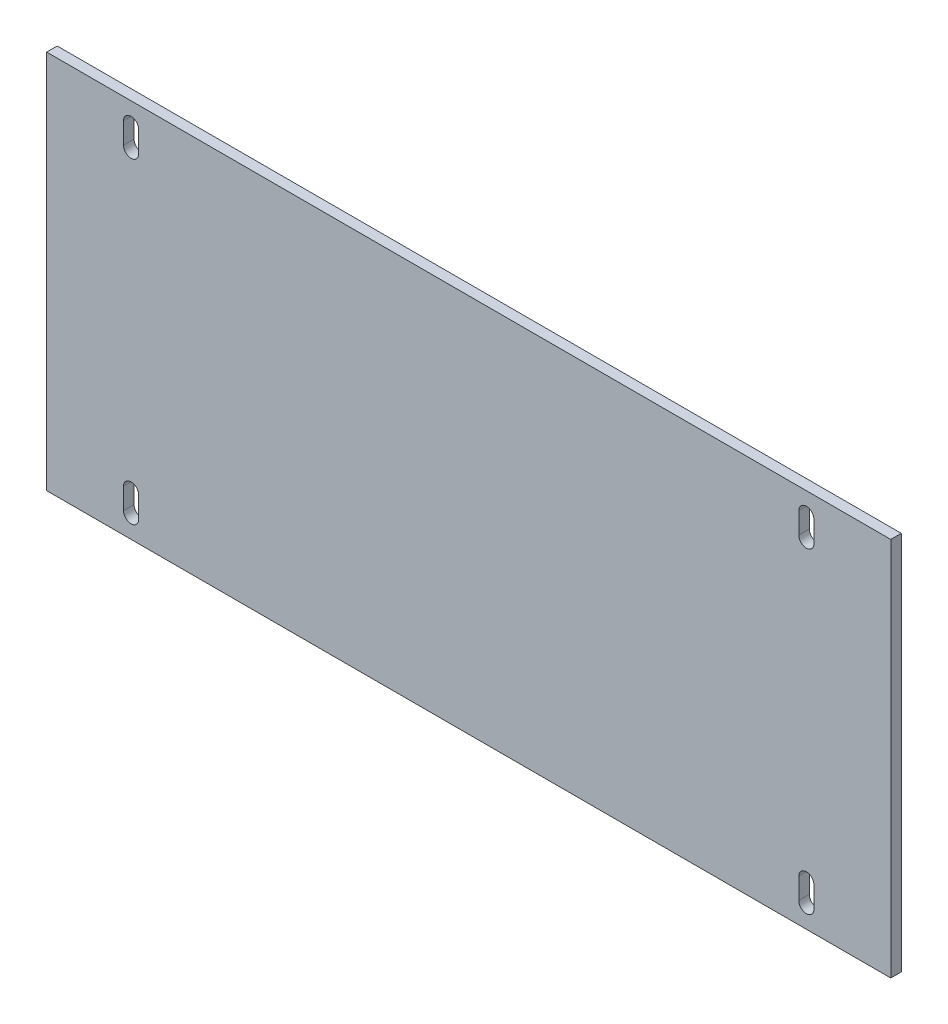
ISO-10303-21;
HEADER;
FILE_DESCRIPTION(('STEP AP214'),'2;1');
FILE_NAME('part.step','',(''),(''),'','','');
FILE_SCHEMA(('AUTOMOTIVE_DESIGN { 1 0 10303 214 1 1 1 1 }'));
ENDSEC;
DATA;
#1=APPLICATION_CONTEXT('core data for automotive mechanical design processes');
#2=APPLICATION_PROTOCOL_DEFINITION('international standard','automotive_design',2000,#1);
#3=PRODUCT_CONTEXT('',#1,'mechanical');
#4=PRODUCT('Part','Part','',(#3));
#5=PRODUCT_RELATED_PRODUCT_CATEGORY('part','',(#4));
#6=PRODUCT_DEFINITION_FORMATION('','',#4);
#7=PRODUCT_DEFINITION_CONTEXT('part definition',#1,'design');
#8=PRODUCT_DEFINITION('design','',#6,#7);
#9=PRODUCT_DEFINITION_SHAPE('','',#8);
#10=(LENGTH_UNIT() NAMED_UNIT(*) SI_UNIT(.MILLI.,.METRE.));
#11=(NAMED_UNIT(*) PLANE_ANGLE_UNIT() SI_UNIT($,.RADIAN.));
#12=(NAMED_UNIT(*) SI_UNIT($,.STERADIAN.) SOLID_ANGLE_UNIT());
#13=UNCERTAINTY_MEASURE_WITH_UNIT(LENGTH_MEASURE(1.E-05),#10,'distance_accuracy_value','');
#14=(GEOMETRIC_REPRESENTATION_CONTEXT(3) GLOBAL_UNCERTAINTY_ASSIGNED_CONTEXT((#13)) GLOBAL_UNIT_ASSIGNED_CONTEXT((#10,
#11,#12)) REPRESENTATION_CONTEXT('',''));
#15=CARTESIAN_POINT('',(0.,0.,0.));
#16=DIRECTION('',(0.,0.,1.));
#17=DIRECTION('',(1.,0.,0.));
#18=AXIS2_PLACEMENT_3D('',#15,#16,#17);
#19=CARTESIAN_POINT('',(0.,0.,5.));
#20=DIRECTION('',(0.,0.,-1.));
#21=DIRECTION('',(-1.,0.,0.));
#22=AXIS2_PLACEMENT_3D('',#19,#20,#21);
#23=PLANE('',#22);
#24=DIRECTION('',(0.,1.,0.));
#25=VECTOR('',#24,1.);
#26=CARTESIAN_POINT('',(163.6,-80.,5.));
#27=LINE('',#26,#25);
#28=CARTESIAN_POINT('',(163.6,-80.,5.));
#29=VERTEX_POINT('',#28);
#30=CARTESIAN_POINT('',(163.6,-70.,5.));
#31=VERTEX_POINT('',#30);
#32=EDGE_CURVE('E201',#29,#31,#27,.T.);
#33=ORIENTED_EDGE('',*,*,#32,.F.);
#34=CARTESIAN_POINT('',(160.,-80.,5.));
#35=DIRECTION('',(0.,0.,1.));
#36=DIRECTION('',(-1.,0.,0.));
#37=AXIS2_PLACEMENT_3D('',#34,#35,#36);
#38=CIRCLE('',#37,3.60000000000002);
#39=CARTESIAN_POINT('',(156.4,-80.,5.));
#40=VERTEX_POINT('',#39);
#41=EDGE_CURVE('E60',#40,#29,#38,.T.);
#42=ORIENTED_EDGE('',*,*,#41,.F.);
#43=DIRECTION('',(0.,-1.,0.));
#44=VECTOR('',#43,1.);
#45=CARTESIAN_POINT('',(156.4,-80.,5.));
#46=LINE('',#45,#44);
#47=CARTESIAN_POINT('',(156.4,-70.,5.));
#48=VERTEX_POINT('',#47);
#49=EDGE_CURVE('E194',#48,#40,#46,.T.);
#50=ORIENTED_EDGE('',*,*,#49,.F.);
#51=CARTESIAN_POINT('',(160.,-70.,5.));
#52=DIRECTION('',(0.,0.,1.));
#53=DIRECTION('',(-1.,0.,0.));
#54=AXIS2_PLACEMENT_3D('',#51,#52,#53);
#55=CIRCLE('',#54,3.60000000000002);
#56=EDGE_CURVE('E208',#31,#48,#55,.T.);
#57=ORIENTED_EDGE('',*,*,#56,.F.);
#58=EDGE_LOOP('',(#33,#42,#50,#57));
#59=FACE_BOUND('',#58,.T.);
#60=CARTESIAN_POINT('',(160.,80.,5.));
#61=DIRECTION('',(0.,0.,-1.));
#62=DIRECTION('',(-1.,0.,0.));
#63=AXIS2_PLACEMENT_3D('',#60,#61,#62);
#64=CIRCLE('',#63,3.60000000000002);
#65=CARTESIAN_POINT('',(156.4,80.,5.));
#66=VERTEX_POINT('',#65);
#67=CARTESIAN_POINT('',(163.6,80.,5.));
#68=VERTEX_POINT('',#67);
#69=EDGE_CURVE('E256',#66,#68,#64,.T.);
#70=ORIENTED_EDGE('',*,*,#69,.T.);
#71=DIRECTION('',(0.,-1.,0.));
#72=VECTOR('',#71,1.);
#73=CARTESIAN_POINT('',(163.6,80.,5.));
#74=LINE('',#73,#72);
#75=CARTESIAN_POINT('',(163.6,70.,5.));
#76=VERTEX_POINT('',#75);
#77=EDGE_CURVE('E265',#68,#76,#74,.T.);
#78=ORIENTED_EDGE('',*,*,#77,.T.);
#79=CARTESIAN_POINT('',(160.,70.,5.));
#80=DIRECTION('',(0.,0.,-1.));
#81=DIRECTION('',(-1.,0.,0.));
#82=AXIS2_PLACEMENT_3D('',#79,#80,#81);
#83=CIRCLE('',#82,3.60000000000002);
#84=CARTESIAN_POINT('',(156.4,70.,5.));
#85=VERTEX_POINT('',#84);
#86=EDGE_CURVE('E262',#76,#85,#83,.T.);
#87=ORIENTED_EDGE('',*,*,#86,.T.);
#88=DIRECTION('',(0.,1.,0.));
#89=VECTOR('',#88,1.);
#90=CARTESIAN_POINT('',(156.4,80.,5.));
#91=LINE('',#90,#89);
#92=EDGE_CURVE('E259',#85,#66,#91,.T.);
#93=ORIENTED_EDGE('',*,*,#92,.T.);
#94=EDGE_LOOP('',(#70,#78,#87,#93));
#95=FACE_BOUND('',#94,.T.);
#96=DIRECTION('',(0.,-1.,0.));
#97=VECTOR('',#96,1.);
#98=CARTESIAN_POINT('',(-163.6,80.,5.));
#99=LINE('',#98,#97);
#100=CARTESIAN_POINT('',(-163.6,80.,5.));
#101=VERTEX_POINT('',#100);
#102=CARTESIAN_POINT('',(-163.6,70.,5.));
#103=VERTEX_POINT('',#102);
#104=EDGE_CURVE('E291',#101,#103,#99,.T.);
#105=ORIENTED_EDGE('',*,*,#104,.F.);
#106=CARTESIAN_POINT('',(-160.,80.,5.));
#107=DIRECTION('',(0.,0.,1.));
#108=DIRECTION('',(1.,0.,0.));
#109=AXIS2_PLACEMENT_3D('',#106,#107,#108);
#110=CIRCLE('',#109,3.60000000000002);
#111=CARTESIAN_POINT('',(-156.4,80.,5.));
#112=VERTEX_POINT('',#111);
#113=EDGE_CURVE('E289',#112,#101,#110,.T.);
#114=ORIENTED_EDGE('',*,*,#113,.F.);
#115=DIRECTION('',(0.,1.,0.));
#116=VECTOR('',#115,1.);
#117=CARTESIAN_POINT('',(-156.4,80.,5.));
#118=LINE('',#117,#116);
#119=CARTESIAN_POINT('',(-156.4,70.,5.));
#120=VERTEX_POINT('',#119);
#121=EDGE_CURVE('E297',#120,#112,#118,.T.);
#122=ORIENTED_EDGE('',*,*,#121,.F.);
#123=CARTESIAN_POINT('',(-160.,70.,5.));
#124=DIRECTION('',(0.,0.,1.));
#125=DIRECTION('',(1.,0.,0.));
#126=AXIS2_PLACEMENT_3D('',#123,#124,#125);
#127=CIRCLE('',#126,3.60000000000002);
#128=EDGE_CURVE('E294',#103,#120,#127,.T.);
#129=ORIENTED_EDGE('',*,*,#128,.F.);
#130=EDGE_LOOP('',(#105,#114,#122,#129));
#131=FACE_BOUND('',#130,.T.);
#132=DIRECTION('',(0.,1.,0.));
#133=VECTOR('',#132,1.);
#134=CARTESIAN_POINT('',(200.,-90.,5.));
#135=LINE('',#134,#133);
#136=CARTESIAN_POINT('',(200.,-90.,5.));
#137=VERTEX_POINT('',#136);
#138=CARTESIAN_POINT('',(200.,90.,5.));
#139=VERTEX_POINT('',#138);
#140=EDGE_CURVE('E313',#137,#139,#135,.T.);
#141=ORIENTED_EDGE('',*,*,#140,.T.);
#142=DIRECTION('',(-1.,0.,0.));
#143=VECTOR('',#142,1.);
#144=CARTESIAN_POINT('',(-200.,90.,5.));
#145=LINE('',#144,#143);
#146=CARTESIAN_POINT('',(-200.,90.,5.));
#147=VERTEX_POINT('',#146);
#148=EDGE_CURVE('E316',#139,#147,#145,.T.);
#149=ORIENTED_EDGE('',*,*,#148,.T.);
#150=DIRECTION('',(0.,-1.,0.));
#151=VECTOR('',#150,1.);
#152=CARTESIAN_POINT('',(-200.,-90.,5.));
#153=LINE('',#152,#151);
#154=CARTESIAN_POINT('',(-200.,-90.,5.));
#155=VERTEX_POINT('',#154);
#156=EDGE_CURVE('E319',#147,#155,#153,.T.);
#157=ORIENTED_EDGE('',*,*,#156,.T.);
#158=DIRECTION('',(1.,0.,0.));
#159=VECTOR('',#158,1.);
#160=CARTESIAN_POINT('',(-200.,-90.,5.));
#161=LINE('',#160,#159);
#162=EDGE_CURVE('E321',#155,#137,#161,.T.);
#163=ORIENTED_EDGE('',*,*,#162,.T.);
#164=EDGE_LOOP('',(#141,#149,#157,#163));
#165=FACE_BOUND('',#164,.T.);
#166=CARTESIAN_POINT('',(-160.,-80.,5.));
#167=DIRECTION('',(0.,0.,-1.));
#168=DIRECTION('',(1.,0.,0.));
#169=AXIS2_PLACEMENT_3D('',#166,#167,#168);
#170=CIRCLE('',#169,3.60000000000002);
#171=CARTESIAN_POINT('',(-156.4,-80.,5.));
#172=VERTEX_POINT('',#171);
#173=CARTESIAN_POINT('',(-163.6,-80.,5.));
#174=VERTEX_POINT('',#173);
#175=EDGE_CURVE('E224',#172,#174,#170,.T.);
#176=ORIENTED_EDGE('',*,*,#175,.T.);
#177=DIRECTION('',(0.,1.,0.));
#178=VECTOR('',#177,1.);
#179=CARTESIAN_POINT('',(-163.6,-80.,5.));
#180=LINE('',#179,#178);
#181=CARTESIAN_POINT('',(-163.6,-70.,5.));
#182=VERTEX_POINT('',#181);
#183=EDGE_CURVE('E233',#174,#182,#180,.T.);
#184=ORIENTED_EDGE('',*,*,#183,.T.);
#185=CARTESIAN_POINT('',(-160.,-70.,5.));
#186=DIRECTION('',(0.,0.,-1.));
#187=DIRECTION('',(1.,0.,0.));
#188=AXIS2_PLACEMENT_3D('',#185,#186,#187);
#189=CIRCLE('',#188,3.60000000000002);
#190=CARTESIAN_POINT('',(-156.4,-70.,5.));
#191=VERTEX_POINT('',#190);
#192=EDGE_CURVE('E230',#182,#191,#189,.T.);
#193=ORIENTED_EDGE('',*,*,#192,.T.);
#194=DIRECTION('',(0.,-1.,0.));
#195=VECTOR('',#194,1.);
#196=CARTESIAN_POINT('',(-156.4,-80.,5.));
#197=LINE('',#196,#195);
#198=EDGE_CURVE('E227',#191,#172,#197,.T.);
#199=ORIENTED_EDGE('',*,*,#198,.T.);
#200=EDGE_LOOP('',(#176,#184,#193,#199));
#201=FACE_BOUND('',#200,.T.);
#202=ADVANCED_FACE('F45',(#59,#95,#131,#165,#201),#23,.F.);
#203=CARTESIAN_POINT('',(0.,0.,0.));
#204=DIRECTION('',(0.,0.,-1.));
#205=DIRECTION('',(-1.,0.,0.));
#206=AXIS2_PLACEMENT_3D('',#203,#204,#205);
#207=PLANE('',#206);
#208=CARTESIAN_POINT('',(160.,-80.,0.));
#209=DIRECTION('',(0.,0.,-1.));
#210=DIRECTION('',(-1.,0.,0.));
#211=AXIS2_PLACEMENT_3D('',#208,#209,#210);
#212=CIRCLE('',#211,3.60000000000002);
#213=CARTESIAN_POINT('',(156.4,-80.,0.));
#214=VERTEX_POINT('',#213);
#215=CARTESIAN_POINT('',(163.6,-80.,0.));
#216=VERTEX_POINT('',#215);
#217=EDGE_CURVE('E192',#214,#216,#212,.F.);
#218=ORIENTED_EDGE('',*,*,#217,.T.);
#219=DIRECTION('',(0.,1.,0.));
#220=VECTOR('',#219,1.);
#221=CARTESIAN_POINT('',(163.6,-80.,0.));
#222=LINE('',#221,#220);
#223=CARTESIAN_POINT('',(163.6,-70.,0.));
#224=VERTEX_POINT('',#223);
#225=EDGE_CURVE('E181',#216,#224,#222,.T.);
#226=ORIENTED_EDGE('',*,*,#225,.T.);
#227=CARTESIAN_POINT('',(160.,-70.,0.));
#228=DIRECTION('',(0.,0.,-1.));
#229=DIRECTION('',(-1.,0.,0.));
#230=AXIS2_PLACEMENT_3D('',#227,#228,#229);
#231=CIRCLE('',#230,3.60000000000002);
#232=CARTESIAN_POINT('',(156.4,-70.,0.));
#233=VERTEX_POINT('',#232);
#234=EDGE_CURVE('E203',#224,#233,#231,.F.);
#235=ORIENTED_EDGE('',*,*,#234,.T.);
#236=DIRECTION('',(0.,-1.,0.));
#237=VECTOR('',#236,1.);
#238=CARTESIAN_POINT('',(156.4,-80.,0.));
#239=LINE('',#238,#237);
#240=EDGE_CURVE('E199',#233,#214,#239,.T.);
#241=ORIENTED_EDGE('',*,*,#240,.T.);
#242=EDGE_LOOP('',(#218,#226,#235,#241));
#243=FACE_BOUND('',#242,.T.);
#244=CARTESIAN_POINT('',(-160.,80.,0.));
#245=DIRECTION('',(0.,0.,-1.));
#246=DIRECTION('',(-1.,0.,0.));
#247=AXIS2_PLACEMENT_3D('',#244,#245,#246);
#248=CIRCLE('',#247,3.60000000000002);
#249=CARTESIAN_POINT('',(-156.4,80.,0.));
#250=VERTEX_POINT('',#249);
#251=CARTESIAN_POINT('',(-163.6,80.,0.));
#252=VERTEX_POINT('',#251);
#253=EDGE_CURVE('E286',#250,#252,#248,.F.);
#254=ORIENTED_EDGE('',*,*,#253,.T.);
#255=DIRECTION('',(0.,-1.,0.));
#256=VECTOR('',#255,1.);
#257=CARTESIAN_POINT('',(-163.6,80.,0.));
#258=LINE('',#257,#256);
#259=CARTESIAN_POINT('',(-163.6,70.,0.));
#260=VERTEX_POINT('',#259);
#261=EDGE_CURVE('E303',#252,#260,#258,.T.);
#262=ORIENTED_EDGE('',*,*,#261,.T.);
#263=CARTESIAN_POINT('',(-160.,70.,0.));
#264=DIRECTION('',(0.,0.,-1.));
#265=DIRECTION('',(-1.,0.,0.));
#266=AXIS2_PLACEMENT_3D('',#263,#264,#265);
#267=CIRCLE('',#266,3.60000000000002);
#268=CARTESIAN_POINT('',(-156.4,70.,0.));
#269=VERTEX_POINT('',#268);
#270=EDGE_CURVE('E280',#260,#269,#267,.F.);
#271=ORIENTED_EDGE('',*,*,#270,.T.);
#272=DIRECTION('',(0.,1.,0.));
#273=VECTOR('',#272,1.);
#274=CARTESIAN_POINT('',(-156.4,80.,0.));
#275=LINE('',#274,#273);
#276=EDGE_CURVE('E283',#269,#250,#275,.T.);
#277=ORIENTED_EDGE('',*,*,#276,.T.);
#278=EDGE_LOOP('',(#254,#262,#271,#277));
#279=FACE_BOUND('',#278,.T.);
#280=DIRECTION('',(0.,1.,0.));
#281=VECTOR('',#280,1.);
#282=CARTESIAN_POINT('',(200.,-90.,0.));
#283=LINE('',#282,#281);
#284=CARTESIAN_POINT('',(200.,-90.,0.));
#285=VERTEX_POINT('',#284);
#286=CARTESIAN_POINT('',(200.,90.,0.));
#287=VERTEX_POINT('',#286);
#288=EDGE_CURVE('E312',#285,#287,#283,.T.);
#289=ORIENTED_EDGE('',*,*,#288,.F.);
#290=DIRECTION('',(1.,0.,0.));
#291=VECTOR('',#290,1.);
#292=CARTESIAN_POINT('',(-200.,-90.,0.));
#293=LINE('',#292,#291);
#294=CARTESIAN_POINT('',(-200.,-90.,0.));
#295=VERTEX_POINT('',#294);
#296=EDGE_CURVE('E317',#295,#285,#293,.T.);
#297=ORIENTED_EDGE('',*,*,#296,.F.);
#298=DIRECTION('',(0.,-1.,0.));
#299=VECTOR('',#298,1.);
#300=CARTESIAN_POINT('',(-200.,-90.,0.));
#301=LINE('',#300,#299);
#302=CARTESIAN_POINT('',(-200.,90.,0.));
#303=VERTEX_POINT('',#302);
#304=EDGE_CURVE('E328',#303,#295,#301,.T.);
#305=ORIENTED_EDGE('',*,*,#304,.F.);
#306=DIRECTION('',(-1.,0.,0.));
#307=VECTOR('',#306,1.);
#308=CARTESIAN_POINT('',(-200.,90.,0.));
#309=LINE('',#308,#307);
#310=EDGE_CURVE('E326',#287,#303,#309,.T.);
#311=ORIENTED_EDGE('',*,*,#310,.F.);
#312=EDGE_LOOP('',(#289,#297,#305,#311));
#313=FACE_BOUND('',#312,.T.);
#314=DIRECTION('',(0.,-1.,0.));
#315=VECTOR('',#314,1.);
#316=CARTESIAN_POINT('',(163.6,80.,0.));
#317=LINE('',#316,#315);
#318=CARTESIAN_POINT('',(163.6,80.,0.));
#319=VERTEX_POINT('',#318);
#320=CARTESIAN_POINT('',(163.6,70.,0.));
#321=VERTEX_POINT('',#320);
#322=EDGE_CURVE('E250',#319,#321,#317,.T.);
#323=ORIENTED_EDGE('',*,*,#322,.F.);
#324=CARTESIAN_POINT('',(160.,80.,0.));
#325=DIRECTION('',(0.,0.,-1.));
#326=DIRECTION('',(-1.,0.,0.));
#327=AXIS2_PLACEMENT_3D('',#324,#325,#326);
#328=CIRCLE('',#327,3.60000000000002);
#329=CARTESIAN_POINT('',(156.4,80.,0.));
#330=VERTEX_POINT('',#329);
#331=EDGE_CURVE('E253',#330,#319,#328,.T.);
#332=ORIENTED_EDGE('',*,*,#331,.F.);
#333=DIRECTION('',(0.,1.,0.));
#334=VECTOR('',#333,1.);
#335=CARTESIAN_POINT('',(156.4,80.,0.));
#336=LINE('',#335,#334);
#337=CARTESIAN_POINT('',(156.4,70.,0.));
#338=VERTEX_POINT('',#337);
#339=EDGE_CURVE('E271',#338,#330,#336,.T.);
#340=ORIENTED_EDGE('',*,*,#339,.F.);
#341=CARTESIAN_POINT('',(160.,70.,0.));
#342=DIRECTION('',(0.,0.,-1.));
#343=DIRECTION('',(-1.,0.,0.));
#344=AXIS2_PLACEMENT_3D('',#341,#342,#343);
#345=CIRCLE('',#344,3.60000000000002);
#346=EDGE_CURVE('E248',#321,#338,#345,.T.);
#347=ORIENTED_EDGE('',*,*,#346,.F.);
#348=EDGE_LOOP('',(#323,#332,#340,#347));
#349=FACE_BOUND('',#348,.T.);
#350=DIRECTION('',(0.,1.,0.));
#351=VECTOR('',#350,1.);
#352=CARTESIAN_POINT('',(-163.6,-80.,0.));
#353=LINE('',#352,#351);
#354=CARTESIAN_POINT('',(-163.6,-80.,0.));
#355=VERTEX_POINT('',#354);
#356=CARTESIAN_POINT('',(-163.6,-70.,0.));
#357=VERTEX_POINT('',#356);
#358=EDGE_CURVE('E218',#355,#357,#353,.T.);
#359=ORIENTED_EDGE('',*,*,#358,.F.);
#360=CARTESIAN_POINT('',(-160.,-80.,0.));
#361=DIRECTION('',(0.,0.,-1.));
#362=DIRECTION('',(-1.,0.,0.));
#363=AXIS2_PLACEMENT_3D('',#360,#361,#362);
#364=CIRCLE('',#363,3.60000000000002);
#365=CARTESIAN_POINT('',(-156.4,-80.,0.));
#366=VERTEX_POINT('',#365);
#367=EDGE_CURVE('E221',#366,#355,#364,.T.);
#368=ORIENTED_EDGE('',*,*,#367,.F.);
#369=DIRECTION('',(0.,-1.,0.));
#370=VECTOR('',#369,1.);
#371=CARTESIAN_POINT('',(-156.4,-80.,0.));
#372=LINE('',#371,#370);
#373=CARTESIAN_POINT('',(-156.4,-70.,0.));
#374=VERTEX_POINT('',#373);
#375=EDGE_CURVE('E239',#374,#366,#372,.T.);
#376=ORIENTED_EDGE('',*,*,#375,.F.);
#377=CARTESIAN_POINT('',(-160.,-70.,0.));
#378=DIRECTION('',(0.,0.,-1.));
#379=DIRECTION('',(-1.,0.,0.));
#380=AXIS2_PLACEMENT_3D('',#377,#378,#379);
#381=CIRCLE('',#380,3.60000000000002);
#382=EDGE_CURVE('E188',#357,#374,#381,.T.);
#383=ORIENTED_EDGE('',*,*,#382,.F.);
#384=EDGE_LOOP('',(#359,#368,#376,#383));
#385=FACE_BOUND('',#384,.T.);
#386=ADVANCED_FACE('F197',(#243,#279,#313,#349,#385),#207,.T.);
#387=CARTESIAN_POINT('',(200.,-90.,5.));
#388=DIRECTION('',(-1.,0.,0.));
#389=DIRECTION('',(0.,0.,1.));
#390=AXIS2_PLACEMENT_3D('',#387,#388,#389);
#391=PLANE('',#390);
#392=ORIENTED_EDGE('',*,*,#288,.T.);
#393=DIRECTION('',(0.,0.,-1.));
#394=VECTOR('',#393,1.);
#395=CARTESIAN_POINT('',(200.,90.,5.));
#396=LINE('',#395,#394);
#397=EDGE_CURVE('E11',#139,#287,#396,.T.);
#398=ORIENTED_EDGE('',*,*,#397,.F.);
#399=ORIENTED_EDGE('',*,*,#140,.F.);
#400=DIRECTION('',(0.,0.,-1.));
#401=VECTOR('',#400,1.);
#402=CARTESIAN_POINT('',(200.,-90.,5.));
#403=LINE('',#402,#401);
#404=EDGE_CURVE('E323',#137,#285,#403,.T.);
#405=ORIENTED_EDGE('',*,*,#404,.T.);
#406=EDGE_LOOP('',(#392,#398,#399,#405));
#407=FACE_BOUND('',#406,.T.);
#408=ADVANCED_FACE('F47',(#407),#391,.F.);
#409=CARTESIAN_POINT('',(-200.,90.,5.));
#410=DIRECTION('',(0.,-1.,0.));
#411=DIRECTION('',(0.,0.,-1.));
#412=AXIS2_PLACEMENT_3D('',#409,#410,#411);
#413=PLANE('',#412);
#414=ORIENTED_EDGE('',*,*,#310,.T.);
#415=DIRECTION('',(0.,0.,-1.));
#416=VECTOR('',#415,1.);
#417=CARTESIAN_POINT('',(-200.,90.,5.));
#418=LINE('',#417,#416);
#419=EDGE_CURVE('E53',#147,#303,#418,.T.);
#420=ORIENTED_EDGE('',*,*,#419,.F.);
#421=ORIENTED_EDGE('',*,*,#148,.F.);
#422=ORIENTED_EDGE('',*,*,#397,.T.);
#423=EDGE_LOOP('',(#414,#420,#421,#422));
#424=FACE_BOUND('',#423,.T.);
#425=ADVANCED_FACE('F356',(#424),#413,.F.);
#426=CARTESIAN_POINT('',(-200.,-90.,5.));
#427=DIRECTION('',(1.,0.,0.));
#428=DIRECTION('',(0.,0.,-1.));
#429=AXIS2_PLACEMENT_3D('',#426,#427,#428);
#430=PLANE('',#429);
#431=ORIENTED_EDGE('',*,*,#304,.T.);
#432=DIRECTION('',(0.,0.,-1.));
#433=VECTOR('',#432,1.);
#434=CARTESIAN_POINT('',(-200.,-90.,5.));
#435=LINE('',#434,#433);
#436=EDGE_CURVE('E333',#155,#295,#435,.T.);
#437=ORIENTED_EDGE('',*,*,#436,.F.);
#438=ORIENTED_EDGE('',*,*,#156,.F.);
#439=ORIENTED_EDGE('',*,*,#419,.T.);
#440=EDGE_LOOP('',(#431,#437,#438,#439));
#441=FACE_BOUND('',#440,.T.);
#442=ADVANCED_FACE('F340',(#441),#430,.F.);
#443=CARTESIAN_POINT('',(-200.,-90.,5.));
#444=DIRECTION('',(0.,1.,0.));
#445=DIRECTION('',(0.,0.,1.));
#446=AXIS2_PLACEMENT_3D('',#443,#444,#445);
#447=PLANE('',#446);
#448=ORIENTED_EDGE('',*,*,#296,.T.);
#449=ORIENTED_EDGE('',*,*,#404,.F.);
#450=ORIENTED_EDGE('',*,*,#162,.F.);
#451=ORIENTED_EDGE('',*,*,#436,.T.);
#452=EDGE_LOOP('',(#448,#449,#450,#451));
#453=FACE_BOUND('',#452,.T.);
#454=ADVANCED_FACE('F349',(#453),#447,.F.);
#455=CARTESIAN_POINT('',(-160.,80.,-0.00100000000000013));
#456=DIRECTION('',(0.,0.,1.));
#457=DIRECTION('',(1.,0.,0.));
#458=AXIS2_PLACEMENT_3D('',#455,#456,#457);
#459=CYLINDRICAL_SURFACE('',#458,3.60000000000002);
#460=DIRECTION('',(0.,0.,1.));
#461=VECTOR('',#460,1.);
#462=CARTESIAN_POINT('',(-156.4,80.,-0.00100000000000013));
#463=LINE('',#462,#461);
#464=EDGE_CURVE('E301',#250,#112,#463,.T.);
#465=ORIENTED_EDGE('',*,*,#464,.T.);
#466=ORIENTED_EDGE('',*,*,#113,.T.);
#467=DIRECTION('',(0.,0.,1.));
#468=VECTOR('',#467,1.);
#469=CARTESIAN_POINT('',(-163.6,80.,-0.00100000000000013));
#470=LINE('',#469,#468);
#471=EDGE_CURVE('E300',#252,#101,#470,.T.);
#472=ORIENTED_EDGE('',*,*,#471,.F.);
#473=ORIENTED_EDGE('',*,*,#253,.F.);
#474=EDGE_LOOP('',(#465,#466,#472,#473));
#475=FACE_BOUND('',#474,.T.);
#476=ADVANCED_FACE('F373',(#475),#459,.F.);
#477=CARTESIAN_POINT('',(-156.4,80.,-0.00100000000000013));
#478=DIRECTION('',(1.,0.,0.));
#479=DIRECTION('',(0.,0.,-1.));
#480=AXIS2_PLACEMENT_3D('',#477,#478,#479);
#481=PLANE('',#480);
#482=DIRECTION('',(0.,0.,1.));
#483=VECTOR('',#482,1.);
#484=CARTESIAN_POINT('',(-156.4,70.,-0.00100000000000013));
#485=LINE('',#484,#483);
#486=EDGE_CURVE('E304',#269,#120,#485,.T.);
#487=ORIENTED_EDGE('',*,*,#486,.T.);
#488=ORIENTED_EDGE('',*,*,#121,.T.);
#489=ORIENTED_EDGE('',*,*,#464,.F.);
#490=ORIENTED_EDGE('',*,*,#276,.F.);
#491=EDGE_LOOP('',(#487,#488,#489,#490));
#492=FACE_BOUND('',#491,.T.);
#493=ADVANCED_FACE('F380',(#492),#481,.F.);
#494=CARTESIAN_POINT('',(-160.,70.,-0.00100000000000013));
#495=DIRECTION('',(0.,0.,1.));
#496=DIRECTION('',(1.,0.,0.));
#497=AXIS2_PLACEMENT_3D('',#494,#495,#496);
#498=CYLINDRICAL_SURFACE('',#497,3.60000000000002);
#499=DIRECTION('',(0.,0.,1.));
#500=VECTOR('',#499,1.);
#501=CARTESIAN_POINT('',(-163.6,70.,-0.00100000000000013));
#502=LINE('',#501,#500);
#503=EDGE_CURVE('E306',#260,#103,#502,.T.);
#504=ORIENTED_EDGE('',*,*,#503,.T.);
#505=ORIENTED_EDGE('',*,*,#128,.T.);
#506=ORIENTED_EDGE('',*,*,#486,.F.);
#507=ORIENTED_EDGE('',*,*,#270,.F.);
#508=EDGE_LOOP('',(#504,#505,#506,#507));
#509=FACE_BOUND('',#508,.T.);
#510=ADVANCED_FACE('F385',(#509),#498,.F.);
#511=CARTESIAN_POINT('',(-163.6,80.,-0.00100000000000013));
#512=DIRECTION('',(-1.,0.,0.));
#513=DIRECTION('',(0.,0.,1.));
#514=AXIS2_PLACEMENT_3D('',#511,#512,#513);
#515=PLANE('',#514);
#516=ORIENTED_EDGE('',*,*,#471,.T.);
#517=ORIENTED_EDGE('',*,*,#104,.T.);
#518=ORIENTED_EDGE('',*,*,#503,.F.);
#519=ORIENTED_EDGE('',*,*,#261,.F.);
#520=EDGE_LOOP('',(#516,#517,#518,#519));
#521=FACE_BOUND('',#520,.T.);
#522=ADVANCED_FACE('F397',(#521),#515,.F.);
#523=CARTESIAN_POINT('',(160.,80.,-0.00100000000000013));
#524=DIRECTION('',(0.,0.,1.));
#525=DIRECTION('',(1.,0.,0.));
#526=AXIS2_PLACEMENT_3D('',#523,#524,#525);
#527=CYLINDRICAL_SURFACE('',#526,3.60000000000002);
#528=ORIENTED_EDGE('',*,*,#331,.T.);
#529=DIRECTION('',(0.,0.,1.));
#530=VECTOR('',#529,1.);
#531=CARTESIAN_POINT('',(163.6,80.,-0.00100000000000013));
#532=LINE('',#531,#530);
#533=EDGE_CURVE('E269',#319,#68,#532,.T.);
#534=ORIENTED_EDGE('',*,*,#533,.T.);
#535=ORIENTED_EDGE('',*,*,#69,.F.);
#536=DIRECTION('',(0.,0.,1.));
#537=VECTOR('',#536,1.);
#538=CARTESIAN_POINT('',(156.4,80.,-0.00100000000000013));
#539=LINE('',#538,#537);
#540=EDGE_CURVE('E268',#330,#66,#539,.T.);
#541=ORIENTED_EDGE('',*,*,#540,.F.);
#542=EDGE_LOOP('',(#528,#534,#535,#541));
#543=FACE_BOUND('',#542,.T.);
#544=ADVANCED_FACE('F404',(#543),#527,.F.);
#545=CARTESIAN_POINT('',(163.6,80.,-0.00100000000000013));
#546=DIRECTION('',(-1.,0.,0.));
#547=DIRECTION('',(0.,0.,1.));
#548=AXIS2_PLACEMENT_3D('',#545,#546,#547);
#549=PLANE('',#548);
#550=ORIENTED_EDGE('',*,*,#322,.T.);
#551=DIRECTION('',(0.,0.,1.));
#552=VECTOR('',#551,1.);
#553=CARTESIAN_POINT('',(163.6,70.,-0.00100000000000013));
#554=LINE('',#553,#552);
#555=EDGE_CURVE('E272',#321,#76,#554,.T.);
#556=ORIENTED_EDGE('',*,*,#555,.T.);
#557=ORIENTED_EDGE('',*,*,#77,.F.);
#558=ORIENTED_EDGE('',*,*,#533,.F.);
#559=EDGE_LOOP('',(#550,#556,#557,#558));
#560=FACE_BOUND('',#559,.T.);
#561=ADVANCED_FACE('F408',(#560),#549,.T.);
#562=CARTESIAN_POINT('',(160.,70.,-0.00100000000000013));
#563=DIRECTION('',(0.,0.,1.));
#564=DIRECTION('',(1.,0.,0.));
#565=AXIS2_PLACEMENT_3D('',#562,#563,#564);
#566=CYLINDRICAL_SURFACE('',#565,3.60000000000002);
#567=ORIENTED_EDGE('',*,*,#346,.T.);
#568=DIRECTION('',(0.,0.,1.));
#569=VECTOR('',#568,1.);
#570=CARTESIAN_POINT('',(156.4,70.,-0.00100000000000013));
#571=LINE('',#570,#569);
#572=EDGE_CURVE('E274',#338,#85,#571,.T.);
#573=ORIENTED_EDGE('',*,*,#572,.T.);
#574=ORIENTED_EDGE('',*,*,#86,.F.);
#575=ORIENTED_EDGE('',*,*,#555,.F.);
#576=EDGE_LOOP('',(#567,#573,#574,#575));
#577=FACE_BOUND('',#576,.T.);
#578=ADVANCED_FACE('F414',(#577),#566,.F.);
#579=CARTESIAN_POINT('',(156.4,80.,-0.00100000000000013));
#580=DIRECTION('',(1.,0.,0.));
#581=DIRECTION('',(0.,0.,-1.));
#582=AXIS2_PLACEMENT_3D('',#579,#580,#581);
#583=PLANE('',#582);
#584=ORIENTED_EDGE('',*,*,#339,.T.);
#585=ORIENTED_EDGE('',*,*,#540,.T.);
#586=ORIENTED_EDGE('',*,*,#92,.F.);
#587=ORIENTED_EDGE('',*,*,#572,.F.);
#588=EDGE_LOOP('',(#584,#585,#586,#587));
#589=FACE_BOUND('',#588,.T.);
#590=ADVANCED_FACE('F410',(#589),#583,.T.);
#591=CARTESIAN_POINT('',(-160.,-80.,-0.00100000000000013));
#592=DIRECTION('',(0.,0.,1.));
#593=DIRECTION('',(1.,0.,0.));
#594=AXIS2_PLACEMENT_3D('',#591,#592,#593);
#595=CYLINDRICAL_SURFACE('',#594,3.60000000000002);
#596=ORIENTED_EDGE('',*,*,#367,.T.);
#597=DIRECTION('',(0.,0.,1.));
#598=VECTOR('',#597,1.);
#599=CARTESIAN_POINT('',(-163.6,-80.,-0.00100000000000013));
#600=LINE('',#599,#598);
#601=EDGE_CURVE('E237',#355,#174,#600,.T.);
#602=ORIENTED_EDGE('',*,*,#601,.T.);
#603=ORIENTED_EDGE('',*,*,#175,.F.);
#604=DIRECTION('',(0.,0.,1.));
#605=VECTOR('',#604,1.);
#606=CARTESIAN_POINT('',(-156.4,-80.,-0.00100000000000013));
#607=LINE('',#606,#605);
#608=EDGE_CURVE('E236',#366,#172,#607,.T.);
#609=ORIENTED_EDGE('',*,*,#608,.F.);
#610=EDGE_LOOP('',(#596,#602,#603,#609));
#611=FACE_BOUND('',#610,.T.);
#612=ADVANCED_FACE('F413',(#611),#595,.F.);
#613=CARTESIAN_POINT('',(-163.6,-80.,-0.00100000000000013));
#614=DIRECTION('',(1.,0.,0.));
#615=DIRECTION('',(0.,0.,-1.));
#616=AXIS2_PLACEMENT_3D('',#613,#614,#615);
#617=PLANE('',#616);
#618=ORIENTED_EDGE('',*,*,#358,.T.);
#619=DIRECTION('',(0.,0.,1.));
#620=VECTOR('',#619,1.);
#621=CARTESIAN_POINT('',(-163.6,-70.,-0.00100000000000013));
#622=LINE('',#621,#620);
#623=EDGE_CURVE('E240',#357,#182,#622,.T.);
#624=ORIENTED_EDGE('',*,*,#623,.T.);
#625=ORIENTED_EDGE('',*,*,#183,.F.);
#626=ORIENTED_EDGE('',*,*,#601,.F.);
#627=EDGE_LOOP('',(#618,#624,#625,#626));
#628=FACE_BOUND('',#627,.T.);
#629=ADVANCED_FACE('F424',(#628),#617,.T.);
#630=CARTESIAN_POINT('',(-160.,-70.,-0.00100000000000013));
#631=DIRECTION('',(0.,0.,1.));
#632=DIRECTION('',(1.,0.,0.));
#633=AXIS2_PLACEMENT_3D('',#630,#631,#632);
#634=CYLINDRICAL_SURFACE('',#633,3.60000000000002);
#635=ORIENTED_EDGE('',*,*,#382,.T.);
#636=DIRECTION('',(0.,0.,1.));
#637=VECTOR('',#636,1.);
#638=CARTESIAN_POINT('',(-156.4,-70.,-0.00100000000000013));
#639=LINE('',#638,#637);
#640=EDGE_CURVE('E242',#374,#191,#639,.T.);
#641=ORIENTED_EDGE('',*,*,#640,.T.);
#642=ORIENTED_EDGE('',*,*,#192,.F.);
#643=ORIENTED_EDGE('',*,*,#623,.F.);
#644=EDGE_LOOP('',(#635,#641,#642,#643));
#645=FACE_BOUND('',#644,.T.);
#646=ADVANCED_FACE('F429',(#645),#634,.F.);
#647=CARTESIAN_POINT('',(-156.4,-80.,-0.00100000000000013));
#648=DIRECTION('',(-1.,0.,0.));
#649=DIRECTION('',(0.,0.,1.));
#650=AXIS2_PLACEMENT_3D('',#647,#648,#649);
#651=PLANE('',#650);
#652=ORIENTED_EDGE('',*,*,#375,.T.);
#653=ORIENTED_EDGE('',*,*,#608,.T.);
#654=ORIENTED_EDGE('',*,*,#198,.F.);
#655=ORIENTED_EDGE('',*,*,#640,.F.);
#656=EDGE_LOOP('',(#652,#653,#654,#655));
#657=FACE_BOUND('',#656,.T.);
#658=ADVANCED_FACE('F426',(#657),#651,.T.);
#659=CARTESIAN_POINT('',(160.,-80.,-0.00100000000000013));
#660=DIRECTION('',(0.,0.,1.));
#661=DIRECTION('',(1.,0.,0.));
#662=AXIS2_PLACEMENT_3D('',#659,#660,#661);
#663=CYLINDRICAL_SURFACE('',#662,3.60000000000002);
#664=DIRECTION('',(0.,0.,1.));
#665=VECTOR('',#664,1.);
#666=CARTESIAN_POINT('',(156.4,-80.,-0.00100000000000013));
#667=LINE('',#666,#665);
#668=EDGE_CURVE('E189',#214,#40,#667,.T.);
#669=ORIENTED_EDGE('',*,*,#668,.T.);
#670=ORIENTED_EDGE('',*,*,#41,.T.);
#671=DIRECTION('',(0.,0.,1.));
#672=VECTOR('',#671,1.);
#673=CARTESIAN_POINT('',(163.6,-80.,-0.00100000000000013));
#674=LINE('',#673,#672);
#675=EDGE_CURVE('E183',#216,#29,#674,.T.);
#676=ORIENTED_EDGE('',*,*,#675,.F.);
#677=ORIENTED_EDGE('',*,*,#217,.F.);
#678=EDGE_LOOP('',(#669,#670,#676,#677));
#679=FACE_BOUND('',#678,.T.);
#680=ADVANCED_FACE('F191',(#679),#663,.F.);
#681=CARTESIAN_POINT('',(156.4,-80.,-0.00100000000000013));
#682=DIRECTION('',(-1.,0.,0.));
#683=DIRECTION('',(0.,0.,1.));
#684=AXIS2_PLACEMENT_3D('',#681,#682,#683);
#685=PLANE('',#684);
#686=DIRECTION('',(0.,0.,1.));
#687=VECTOR('',#686,1.);
#688=CARTESIAN_POINT('',(156.4,-70.,-0.00100000000000013));
#689=LINE('',#688,#687);
#690=EDGE_CURVE('E214',#233,#48,#689,.T.);
#691=ORIENTED_EDGE('',*,*,#690,.T.);
#692=ORIENTED_EDGE('',*,*,#49,.T.);
#693=ORIENTED_EDGE('',*,*,#668,.F.);
#694=ORIENTED_EDGE('',*,*,#240,.F.);
#695=EDGE_LOOP('',(#691,#692,#693,#694));
#696=FACE_BOUND('',#695,.T.);
#697=ADVANCED_FACE('F439',(#696),#685,.F.);
#698=CARTESIAN_POINT('',(160.,-70.,-0.00100000000000013));
#699=DIRECTION('',(0.,0.,1.));
#700=DIRECTION('',(1.,0.,0.));
#701=AXIS2_PLACEMENT_3D('',#698,#699,#700);
#702=CYLINDRICAL_SURFACE('',#701,3.60000000000002);
#703=DIRECTION('',(0.,0.,1.));
#704=VECTOR('',#703,1.);
#705=CARTESIAN_POINT('',(163.6,-70.,-0.00100000000000013));
#706=LINE('',#705,#704);
#707=EDGE_CURVE('E68',#224,#31,#706,.T.);
#708=ORIENTED_EDGE('',*,*,#707,.T.);
#709=ORIENTED_EDGE('',*,*,#56,.T.);
#710=ORIENTED_EDGE('',*,*,#690,.F.);
#711=ORIENTED_EDGE('',*,*,#234,.F.);
#712=EDGE_LOOP('',(#708,#709,#710,#711));
#713=FACE_BOUND('',#712,.T.);
#714=ADVANCED_FACE('F442',(#713),#702,.F.);
#715=CARTESIAN_POINT('',(163.6,-80.,-0.00100000000000013));
#716=DIRECTION('',(1.,0.,0.));
#717=DIRECTION('',(0.,0.,-1.));
#718=AXIS2_PLACEMENT_3D('',#715,#716,#717);
#719=PLANE('',#718);
#720=ORIENTED_EDGE('',*,*,#675,.T.);
#721=ORIENTED_EDGE('',*,*,#32,.T.);
#722=ORIENTED_EDGE('',*,*,#707,.F.);
#723=ORIENTED_EDGE('',*,*,#225,.F.);
#724=EDGE_LOOP('',(#720,#721,#722,#723));
#725=FACE_BOUND('',#724,.T.);
#726=ADVANCED_FACE('F182',(#725),#719,.F.);
#727=CLOSED_SHELL('',(#202,#386,#408,#425,#442,#454,#476,#493,#510,#522,#544,#561,#578,#590,
#612,#629,#646,#658,#680,#697,#714,#726));
#728=MANIFOLD_SOLID_BREP('B2',#727);
#729=ADVANCED_BREP_SHAPE_REPRESENTATION('',(#18,#728),#14);
#730=SHAPE_DEFINITION_REPRESENTATION(#9,#729);
ENDSEC;
END-ISO-10303-21;
